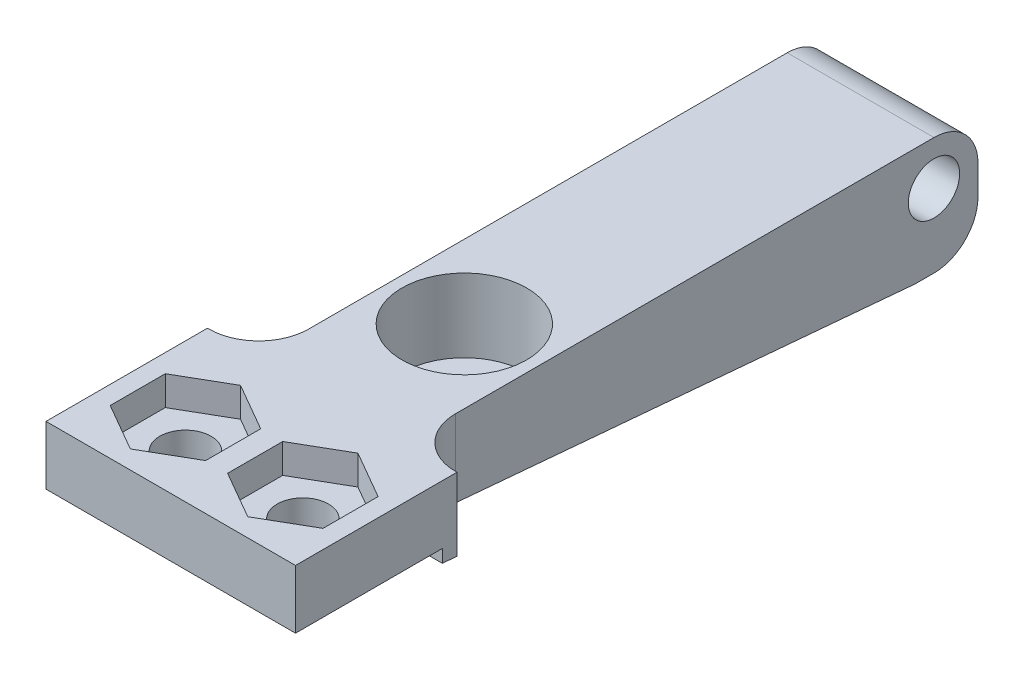
ISO-10303-21;
HEADER;
FILE_DESCRIPTION(('STEP AP214'),'2;1');
FILE_NAME('part.step','',(''),(''),'','','');
FILE_SCHEMA(('AUTOMOTIVE_DESIGN { 1 0 10303 214 1 1 1 1 }'));
ENDSEC;
DATA;
#1=APPLICATION_CONTEXT('core data for automotive mechanical design processes');
#2=APPLICATION_PROTOCOL_DEFINITION('international standard','automotive_design',2000,#1);
#3=PRODUCT_CONTEXT('',#1,'mechanical');
#4=PRODUCT('Part','Part','',(#3));
#5=PRODUCT_RELATED_PRODUCT_CATEGORY('part','',(#4));
#6=PRODUCT_DEFINITION_FORMATION('','',#4);
#7=PRODUCT_DEFINITION_CONTEXT('part definition',#1,'design');
#8=PRODUCT_DEFINITION('design','',#6,#7);
#9=PRODUCT_DEFINITION_SHAPE('','',#8);
#10=(LENGTH_UNIT() NAMED_UNIT(*) SI_UNIT(.MILLI.,.METRE.));
#11=(NAMED_UNIT(*) PLANE_ANGLE_UNIT() SI_UNIT($,.RADIAN.));
#12=(NAMED_UNIT(*) SI_UNIT($,.STERADIAN.) SOLID_ANGLE_UNIT());
#13=UNCERTAINTY_MEASURE_WITH_UNIT(LENGTH_MEASURE(1.E-05),#10,'distance_accuracy_value','');
#14=(GEOMETRIC_REPRESENTATION_CONTEXT(3) GLOBAL_UNCERTAINTY_ASSIGNED_CONTEXT((#13)) GLOBAL_UNIT_ASSIGNED_CONTEXT((#10,
#11,#12)) REPRESENTATION_CONTEXT('',''));
#15=CARTESIAN_POINT('',(0.,0.,0.));
#16=DIRECTION('',(0.,0.,1.));
#17=DIRECTION('',(1.,0.,0.));
#18=AXIS2_PLACEMENT_3D('',#15,#16,#17);
#19=CARTESIAN_POINT('',(4.,-5.,42.));
#20=DIRECTION('',(0.,1.,0.));
#21=DIRECTION('',(0.,0.,-1.));
#22=AXIS2_PLACEMENT_3D('',#19,#20,#21);
#23=CYLINDRICAL_SURFACE('',#22,1.75);
#24=CARTESIAN_POINT('',(4.,-1.,42.));
#25=DIRECTION('',(0.,1.,0.));
#26=DIRECTION('',(0.,0.,1.));
#27=AXIS2_PLACEMENT_3D('',#24,#25,#26);
#28=CIRCLE('',#27,1.75);
#29=CARTESIAN_POINT('',(4.,-1.,43.75));
#30=VERTEX_POINT('',#29);
#31=EDGE_CURVE('E354',#30,#30,#28,.T.);
#32=ORIENTED_EDGE('',*,*,#31,.F.);
#33=EDGE_LOOP('',(#32));
#34=FACE_BOUND('',#33,.T.);
#35=CARTESIAN_POINT('',(4.,1.,42.));
#36=DIRECTION('',(0.,-1.,0.));
#37=DIRECTION('',(0.,0.,-1.));
#38=AXIS2_PLACEMENT_3D('',#35,#36,#37);
#39=CIRCLE('',#38,1.75);
#40=CARTESIAN_POINT('',(4.,1.,40.25));
#41=VERTEX_POINT('',#40);
#42=EDGE_CURVE('E316',#41,#41,#39,.T.);
#43=ORIENTED_EDGE('',*,*,#42,.F.);
#44=EDGE_LOOP('',(#43));
#45=FACE_BOUND('',#44,.T.);
#46=ADVANCED_FACE('F41',(#34,#45),#23,.F.);
#47=CARTESIAN_POINT('',(-4.,-5.,42.));
#48=DIRECTION('',(0.,1.,0.));
#49=DIRECTION('',(0.,0.,-1.));
#50=AXIS2_PLACEMENT_3D('',#47,#48,#49);
#51=CYLINDRICAL_SURFACE('',#50,1.75);
#52=CARTESIAN_POINT('',(-4.,-1.,42.));
#53=DIRECTION('',(0.,1.,0.));
#54=DIRECTION('',(0.,0.,1.));
#55=AXIS2_PLACEMENT_3D('',#52,#53,#54);
#56=CIRCLE('',#55,1.75);
#57=CARTESIAN_POINT('',(-4.,-1.,43.75));
#58=VERTEX_POINT('',#57);
#59=EDGE_CURVE('E45',#58,#58,#56,.T.);
#60=ORIENTED_EDGE('',*,*,#59,.F.);
#61=EDGE_LOOP('',(#60));
#62=FACE_BOUND('',#61,.T.);
#63=CARTESIAN_POINT('',(-4.,1.,42.));
#64=DIRECTION('',(0.,-1.,0.));
#65=DIRECTION('',(0.,0.,-1.));
#66=AXIS2_PLACEMENT_3D('',#63,#64,#65);
#67=CIRCLE('',#66,1.75);
#68=CARTESIAN_POINT('',(-4.,1.,40.25));
#69=VERTEX_POINT('',#68);
#70=EDGE_CURVE('E364',#69,#69,#67,.T.);
#71=ORIENTED_EDGE('',*,*,#70,.F.);
#72=EDGE_LOOP('',(#71));
#73=FACE_BOUND('',#72,.T.);
#74=ADVANCED_FACE('F454',(#62,#73),#51,.F.);
#75=CARTESIAN_POINT('',(8.5,3.,0.));
#76=DIRECTION('',(0.,1.,0.));
#77=DIRECTION('',(0.,0.,-1.));
#78=AXIS2_PLACEMENT_3D('',#75,#76,#77);
#79=PLANE('',#78);
#80=DIRECTION('',(0.,0.,-1.));
#81=VECTOR('',#80,1.);
#82=CARTESIAN_POINT('',(5.00000000000001,3.,-3.));
#83=LINE('',#82,#81);
#84=CARTESIAN_POINT('',(5.,3.,32.6));
#85=VERTEX_POINT('',#84);
#86=CARTESIAN_POINT('',(5.,3.,0.));
#87=VERTEX_POINT('',#86);
#88=EDGE_CURVE('E235',#85,#87,#83,.T.);
#89=ORIENTED_EDGE('',*,*,#88,.T.);
#90=DIRECTION('',(-1.,0.,0.));
#91=VECTOR('',#90,1.);
#92=CARTESIAN_POINT('',(8.5,3.,0.));
#93=LINE('',#92,#91);
#94=CARTESIAN_POINT('',(-5.,3.,0.));
#95=VERTEX_POINT('',#94);
#96=EDGE_CURVE('E443',#87,#95,#93,.T.);
#97=ORIENTED_EDGE('',*,*,#96,.T.);
#98=DIRECTION('',(0.,0.,1.));
#99=VECTOR('',#98,1.);
#100=CARTESIAN_POINT('',(-5.,3.,-3.));
#101=LINE('',#100,#99);
#102=CARTESIAN_POINT('',(-5.,3.,32.6));
#103=VERTEX_POINT('',#102);
#104=EDGE_CURVE('E298',#95,#103,#101,.T.);
#105=ORIENTED_EDGE('',*,*,#104,.T.);
#106=CARTESIAN_POINT('',(-8.4,3.,32.6));
#107=DIRECTION('',(0.,-1.,0.));
#108=DIRECTION('',(0.,0.,-1.));
#109=AXIS2_PLACEMENT_3D('',#106,#107,#108);
#110=CIRCLE('',#109,3.40000000000001);
#111=CARTESIAN_POINT('',(-8.4,3.,36.));
#112=VERTEX_POINT('',#111);
#113=EDGE_CURVE('E295',#103,#112,#110,.T.);
#114=ORIENTED_EDGE('',*,*,#113,.T.);
#115=DIRECTION('',(-1.,0.,-1.38777878078145E-13));
#116=VECTOR('',#115,1.);
#117=CARTESIAN_POINT('',(-8.4,3.,36.));
#118=LINE('',#117,#116);
#119=CARTESIAN_POINT('',(-8.5,3.,36.));
#120=VERTEX_POINT('',#119);
#121=EDGE_CURVE('E287',#112,#120,#118,.T.);
#122=ORIENTED_EDGE('',*,*,#121,.T.);
#123=DIRECTION('',(0.,0.,1.));
#124=VECTOR('',#123,1.);
#125=CARTESIAN_POINT('',(-8.5,3.,0.));
#126=LINE('',#125,#124);
#127=CARTESIAN_POINT('',(-8.5,3.,47.));
#128=VERTEX_POINT('',#127);
#129=EDGE_CURVE('E416',#120,#128,#126,.T.);
#130=ORIENTED_EDGE('',*,*,#129,.T.);
#131=DIRECTION('',(-1.,0.,0.));
#132=VECTOR('',#131,1.);
#133=CARTESIAN_POINT('',(8.5,3.,47.));
#134=LINE('',#133,#132);
#135=CARTESIAN_POINT('',(8.5,3.,47.));
#136=VERTEX_POINT('',#135);
#137=EDGE_CURVE('E415',#136,#128,#134,.T.);
#138=ORIENTED_EDGE('',*,*,#137,.F.);
#139=DIRECTION('',(0.,0.,1.));
#140=VECTOR('',#139,1.);
#141=CARTESIAN_POINT('',(8.5,3.,0.));
#142=LINE('',#141,#140);
#143=CARTESIAN_POINT('',(8.5,3.,36.));
#144=VERTEX_POINT('',#143);
#145=EDGE_CURVE('E245',#144,#136,#142,.T.);
#146=ORIENTED_EDGE('',*,*,#145,.F.);
#147=DIRECTION('',(-1.,0.,1.38777878078145E-13));
#148=VECTOR('',#147,1.);
#149=CARTESIAN_POINT('',(8.4,3.,36.));
#150=LINE('',#149,#148);
#151=CARTESIAN_POINT('',(8.4,3.,36.));
#152=VERTEX_POINT('',#151);
#153=EDGE_CURVE('E230',#144,#152,#150,.T.);
#154=ORIENTED_EDGE('',*,*,#153,.T.);
#155=CARTESIAN_POINT('',(8.4,3.,32.6));
#156=DIRECTION('',(0.,-1.,0.));
#157=DIRECTION('',(0.,0.,-1.));
#158=AXIS2_PLACEMENT_3D('',#155,#156,#157);
#159=CIRCLE('',#158,3.40000000000001);
#160=EDGE_CURVE('E264',#152,#85,#159,.T.);
#161=ORIENTED_EDGE('',*,*,#160,.T.);
#162=EDGE_LOOP('',(#89,#97,#105,#114,#122,#130,#138,#146,#154,#161));
#163=FACE_BOUND('',#162,.T.);
#164=CARTESIAN_POINT('',(0.,3.,27.));
#165=DIRECTION('',(0.,-1.,0.));
#166=DIRECTION('',(0.,0.,-1.));
#167=AXIS2_PLACEMENT_3D('',#164,#165,#166);
#168=CIRCLE('',#167,4.25);
#169=CARTESIAN_POINT('',(0.,3.,22.75));
#170=VERTEX_POINT('',#169);
#171=EDGE_CURVE('E271',#170,#170,#168,.T.);
#172=ORIENTED_EDGE('',*,*,#171,.T.);
#173=EDGE_LOOP('',(#172));
#174=FACE_BOUND('',#173,.T.);
#175=DIRECTION('',(-0.86602540378444,0.,-0.499999999999997));
#176=VECTOR('',#175,1.);
#177=CARTESIAN_POINT('',(-18.8115334794732,3.,32.5825317547307));
#178=LINE('',#177,#176);
#179=CARTESIAN_POINT('',(4.00000000000001,3.,45.7527767497326));
#180=VERTEX_POINT('',#179);
#181=CARTESIAN_POINT('',(0.749999999999983,3.,43.8763883748663));
#182=VERTEX_POINT('',#181);
#183=EDGE_CURVE('E334',#180,#182,#178,.T.);
#184=ORIENTED_EDGE('',*,*,#183,.T.);
#185=DIRECTION('',(0.,0.,-1.));
#186=VECTOR('',#185,1.);
#187=CARTESIAN_POINT('',(0.749999999999976,3.,0.));
#188=LINE('',#187,#186);
#189=CARTESIAN_POINT('',(0.749999999999983,3.,40.1236116251337));
#190=VERTEX_POINT('',#189);
#191=EDGE_CURVE('E337',#182,#190,#188,.T.);
#192=ORIENTED_EDGE('',*,*,#191,.T.);
#193=DIRECTION('',(0.866025403784439,0.,-0.5));
#194=VECTOR('',#193,1.);
#195=CARTESIAN_POINT('',(17.5615334794732,3.,30.4174682452694));
#196=LINE('',#195,#194);
#197=CARTESIAN_POINT('',(4.00000000000001,3.,38.2472232502674));
#198=VERTEX_POINT('',#197);
#199=EDGE_CURVE('E341',#190,#198,#196,.T.);
#200=ORIENTED_EDGE('',*,*,#199,.T.);
#201=DIRECTION('',(0.866025403784439,0.,0.499999999999999));
#202=VECTOR('',#201,1.);
#203=CARTESIAN_POINT('',(-15.5615334794732,3.,26.9533666301317));
#204=LINE('',#203,#202);
#205=CARTESIAN_POINT('',(7.25000000000003,3.,40.1236116251337));
#206=VERTEX_POINT('',#205);
#207=EDGE_CURVE('E344',#198,#206,#204,.T.);
#208=ORIENTED_EDGE('',*,*,#207,.T.);
#209=DIRECTION('',(0.,0.,1.));
#210=VECTOR('',#209,1.);
#211=CARTESIAN_POINT('',(7.25000000000003,3.,0.));
#212=LINE('',#211,#210);
#213=CARTESIAN_POINT('',(7.25000000000003,3.,43.8763883748663));
#214=VERTEX_POINT('',#213);
#215=EDGE_CURVE('E347',#206,#214,#212,.T.);
#216=ORIENTED_EDGE('',*,*,#215,.T.);
#217=DIRECTION('',(-0.866025403784439,0.,0.5));
#218=VECTOR('',#217,1.);
#219=CARTESIAN_POINT('',(20.8115334794732,3.,36.0466333698683));
#220=LINE('',#219,#218);
#221=EDGE_CURVE('E320',#214,#180,#220,.T.);
#222=ORIENTED_EDGE('',*,*,#221,.T.);
#223=EDGE_LOOP('',(#184,#192,#200,#208,#216,#222));
#224=FACE_BOUND('',#223,.T.);
#225=DIRECTION('',(0.866025403784439,0.,0.5));
#226=VECTOR('',#225,1.);
#227=CARTESIAN_POINT('',(-17.5615334794732,3.,30.4174682452695));
#228=LINE('',#227,#226);
#229=CARTESIAN_POINT('',(-4.,3.,38.2472232502674));
#230=VERTEX_POINT('',#229);
#231=CARTESIAN_POINT('',(-0.749999999999987,3.,40.1236116251337));
#232=VERTEX_POINT('',#231);
#233=EDGE_CURVE('E313',#230,#232,#228,.T.);
#234=ORIENTED_EDGE('',*,*,#233,.T.);
#235=DIRECTION('',(0.,0.,1.));
#236=VECTOR('',#235,1.);
#237=CARTESIAN_POINT('',(-0.749999999999987,3.,0.));
#238=LINE('',#237,#236);
#239=CARTESIAN_POINT('',(-0.749999999999987,3.,43.8763883748663));
#240=VERTEX_POINT('',#239);
#241=EDGE_CURVE('E384',#232,#240,#238,.T.);
#242=ORIENTED_EDGE('',*,*,#241,.T.);
#243=DIRECTION('',(-0.866025403784441,0.,0.499999999999996));
#244=VECTOR('',#243,1.);
#245=CARTESIAN_POINT('',(18.8115334794731,3.,32.5825317547307));
#246=LINE('',#245,#244);
#247=CARTESIAN_POINT('',(-3.99999999999999,3.,45.7527767497326));
#248=VERTEX_POINT('',#247);
#249=EDGE_CURVE('E387',#240,#248,#246,.T.);
#250=ORIENTED_EDGE('',*,*,#249,.T.);
#251=DIRECTION('',(-0.86602540378444,0.,-0.499999999999998));
#252=VECTOR('',#251,1.);
#253=CARTESIAN_POINT('',(-20.8115334794731,3.,36.0466333698684));
#254=LINE('',#253,#252);
#255=CARTESIAN_POINT('',(-7.25000000000002,3.,43.8763883748663));
#256=VERTEX_POINT('',#255);
#257=EDGE_CURVE('E390',#248,#256,#254,.T.);
#258=ORIENTED_EDGE('',*,*,#257,.T.);
#259=DIRECTION('',(0.,0.,-1.));
#260=VECTOR('',#259,1.);
#261=CARTESIAN_POINT('',(-7.25000000000001,3.,0.));
#262=LINE('',#261,#260);
#263=CARTESIAN_POINT('',(-7.25000000000001,3.,40.1236116251337));
#264=VERTEX_POINT('',#263);
#265=EDGE_CURVE('E393',#256,#264,#262,.T.);
#266=ORIENTED_EDGE('',*,*,#265,.T.);
#267=DIRECTION('',(0.866025403784439,0.,-0.5));
#268=VECTOR('',#267,1.);
#269=CARTESIAN_POINT('',(15.5615334794732,3.,26.9533666301317));
#270=LINE('',#269,#268);
#271=EDGE_CURVE('E368',#264,#230,#270,.T.);
#272=ORIENTED_EDGE('',*,*,#271,.T.);
#273=EDGE_LOOP('',(#234,#242,#250,#258,#266,#272));
#274=FACE_BOUND('',#273,.T.);
#275=ADVANCED_FACE('F457',(#163,#174,#224,#274),#79,.T.);
#276=CARTESIAN_POINT('',(8.5,0.,0.));
#277=DIRECTION('',(-1.,0.,0.));
#278=DIRECTION('',(0.,0.,-1.));
#279=AXIS2_PLACEMENT_3D('',#276,#277,#278);
#280=CYLINDRICAL_SURFACE('',#279,3.);
#281=DIRECTION('',(-1.,0.,0.));
#282=VECTOR('',#281,1.);
#283=CARTESIAN_POINT('',(8.5,0.,-3.));
#284=LINE('',#283,#282);
#285=CARTESIAN_POINT('',(5.00000000000001,0.,-3.));
#286=VERTEX_POINT('',#285);
#287=CARTESIAN_POINT('',(-5.,0.,-3.));
#288=VERTEX_POINT('',#287);
#289=EDGE_CURVE('E440',#286,#288,#284,.T.);
#290=ORIENTED_EDGE('',*,*,#289,.T.);
#291=CARTESIAN_POINT('',(-5.,0.,0.));
#292=DIRECTION('',(-1.,0.,0.));
#293=DIRECTION('',(0.,0.,1.));
#294=AXIS2_PLACEMENT_3D('',#291,#292,#293);
#295=CIRCLE('',#294,3.);
#296=EDGE_CURVE('E307',#288,#95,#295,.F.);
#297=ORIENTED_EDGE('',*,*,#296,.T.);
#298=ORIENTED_EDGE('',*,*,#96,.F.);
#299=CARTESIAN_POINT('',(5.00000000000001,0.,0.));
#300=DIRECTION('',(1.,0.,0.));
#301=DIRECTION('',(0.,0.,-1.));
#302=AXIS2_PLACEMENT_3D('',#299,#300,#301);
#303=CIRCLE('',#302,3.);
#304=EDGE_CURVE('E309',#87,#286,#303,.F.);
#305=ORIENTED_EDGE('',*,*,#304,.T.);
#306=EDGE_LOOP('',(#290,#297,#298,#305));
#307=FACE_BOUND('',#306,.T.);
#308=ADVANCED_FACE('F535',(#307),#280,.T.);
#309=CARTESIAN_POINT('',(8.5,0.,-3.));
#310=DIRECTION('',(0.,0.,1.));
#311=DIRECTION('',(-1.,0.,0.));
#312=AXIS2_PLACEMENT_3D('',#309,#310,#311);
#313=PLANE('',#312);
#314=DIRECTION('',(-1.,0.,0.));
#315=VECTOR('',#314,1.);
#316=CARTESIAN_POINT('',(8.5,-2.,-3.));
#317=LINE('',#316,#315);
#318=CARTESIAN_POINT('',(-5.,-2.,-3.));
#319=VERTEX_POINT('',#318);
#320=CARTESIAN_POINT('',(5.00000000000001,-2.,-3.));
#321=VERTEX_POINT('',#320);
#322=EDGE_CURVE('E11',#319,#321,#317,.F.);
#323=ORIENTED_EDGE('',*,*,#322,.F.);
#324=DIRECTION('',(0.,1.,0.));
#325=VECTOR('',#324,1.);
#326=CARTESIAN_POINT('',(-5.,-5.001,-3.));
#327=LINE('',#326,#325);
#328=EDGE_CURVE('E285',#319,#288,#327,.T.);
#329=ORIENTED_EDGE('',*,*,#328,.T.);
#330=ORIENTED_EDGE('',*,*,#289,.F.);
#331=DIRECTION('',(0.,1.,0.));
#332=VECTOR('',#331,1.);
#333=CARTESIAN_POINT('',(5.00000000000001,-5.001,-3.));
#334=LINE('',#333,#332);
#335=EDGE_CURVE('E269',#321,#286,#334,.T.);
#336=ORIENTED_EDGE('',*,*,#335,.F.);
#337=EDGE_LOOP('',(#323,#329,#330,#336));
#338=FACE_BOUND('',#337,.T.);
#339=ADVANCED_FACE('F531',(#338),#313,.F.);
#340=CARTESIAN_POINT('',(8.5,-5.,0.));
#341=DIRECTION('',(0.,1.,0.));
#342=DIRECTION('',(0.,0.,-1.));
#343=AXIS2_PLACEMENT_3D('',#340,#341,#342);
#344=PLANE('',#343);
#345=DIRECTION('',(-1.,0.,0.));
#346=VECTOR('',#345,1.);
#347=CARTESIAN_POINT('',(8.5,-5.,1.27979078895471));
#348=LINE('',#347,#346);
#349=CARTESIAN_POINT('',(5.,-5.,1.27979078895471));
#350=VERTEX_POINT('',#349);
#351=CARTESIAN_POINT('',(-5.,-5.,1.27979078895471));
#352=VERTEX_POINT('',#351);
#353=EDGE_CURVE('E437',#350,#352,#348,.T.);
#354=ORIENTED_EDGE('',*,*,#353,.T.);
#355=DIRECTION('',(0.,0.,-1.));
#356=VECTOR('',#355,1.);
#357=CARTESIAN_POINT('',(-5.,-5.,-3.));
#358=LINE('',#357,#356);
#359=CARTESIAN_POINT('',(-5.,-5.,0.));
#360=VERTEX_POINT('',#359);
#361=EDGE_CURVE('E281',#352,#360,#358,.T.);
#362=ORIENTED_EDGE('',*,*,#361,.T.);
#363=DIRECTION('',(-1.,0.,0.));
#364=VECTOR('',#363,1.);
#365=CARTESIAN_POINT('',(8.5,-5.,0.));
#366=LINE('',#365,#364);
#367=CARTESIAN_POINT('',(5.00000000000001,-5.,0.));
#368=VERTEX_POINT('',#367);
#369=EDGE_CURVE('E50',#368,#360,#366,.T.);
#370=ORIENTED_EDGE('',*,*,#369,.F.);
#371=DIRECTION('',(0.,0.,1.));
#372=VECTOR('',#371,1.);
#373=CARTESIAN_POINT('',(5.00000000000001,-5.,-3.));
#374=LINE('',#373,#372);
#375=EDGE_CURVE('E260',#368,#350,#374,.T.);
#376=ORIENTED_EDGE('',*,*,#375,.T.);
#377=EDGE_LOOP('',(#354,#362,#370,#376));
#378=FACE_BOUND('',#377,.T.);
#379=ADVANCED_FACE('F528',(#378),#344,.F.);
#380=CARTESIAN_POINT('',(8.5,-5.07313605167897,0.443841893046577));
#381=DIRECTION('',(0.,0.996194698091746,-0.0871557427476583));
#382=DIRECTION('',(0.,-0.0871557427476583,-0.996194698091746));
#383=AXIS2_PLACEMENT_3D('',#380,#381,#382);
#384=PLANE('',#383);
#385=CARTESIAN_POINT('',(8.4,-2.25983675477331,32.6));
#386=DIRECTION('',(0.,-0.996194698091746,0.0871557427476583));
#387=DIRECTION('',(0.,0.0871557427476583,0.996194698091746));
#388=AXIS2_PLACEMENT_3D('',#385,#386,#387);
#389=ELLIPSE('',#388,3.41298744764739,3.40000000000001);
#390=CARTESIAN_POINT('',(5.,-2.25983675477331,32.6));
#391=VERTEX_POINT('',#390);
#392=CARTESIAN_POINT('',(8.4,-1.96237529878516,36.));
#393=VERTEX_POINT('',#392);
#394=EDGE_CURVE('E250',#391,#393,#389,.F.);
#395=ORIENTED_EDGE('',*,*,#394,.T.);
#396=DIRECTION('',(1.,0.,-1.38777878078145E-13));
#397=VECTOR('',#396,1.);
#398=CARTESIAN_POINT('',(8.40000000000004,-1.96237529878516,36.));
#399=LINE('',#398,#397);
#400=CARTESIAN_POINT('',(8.5,-1.96237529878516,36.));
#401=VERTEX_POINT('',#400);
#402=EDGE_CURVE('E227',#393,#401,#399,.T.);
#403=ORIENTED_EDGE('',*,*,#402,.T.);
#404=DIRECTION('',(0.,0.0871557427476583,0.996194698091746));
#405=VECTOR('',#404,1.);
#406=CARTESIAN_POINT('',(8.5,-5.07313605167897,0.443841893046577));
#407=LINE('',#406,#405);
#408=CARTESIAN_POINT('',(8.5,-1.87488663525924,37.));
#409=VERTEX_POINT('',#408);
#410=EDGE_CURVE('E238',#401,#409,#407,.T.);
#411=ORIENTED_EDGE('',*,*,#410,.T.);
#412=DIRECTION('',(-1.,0.,0.));
#413=VECTOR('',#412,1.);
#414=CARTESIAN_POINT('',(8.5,-1.87488663525924,37.));
#415=LINE('',#414,#413);
#416=CARTESIAN_POINT('',(-8.5,-1.87488663525924,37.));
#417=VERTEX_POINT('',#416);
#418=EDGE_CURVE('E435',#409,#417,#415,.T.);
#419=ORIENTED_EDGE('',*,*,#418,.T.);
#420=DIRECTION('',(0.,0.0871557427476583,0.996194698091746));
#421=VECTOR('',#420,1.);
#422=CARTESIAN_POINT('',(-8.5,-5.07313605167897,0.443841893046577));
#423=LINE('',#422,#421);
#424=CARTESIAN_POINT('',(-8.5,-1.96237529878517,36.));
#425=VERTEX_POINT('',#424);
#426=EDGE_CURVE('E419',#425,#417,#423,.T.);
#427=ORIENTED_EDGE('',*,*,#426,.F.);
#428=DIRECTION('',(1.,0.,1.38777878078145E-13));
#429=VECTOR('',#428,1.);
#430=CARTESIAN_POINT('',(-8.40000000000004,-1.96237529878516,36.));
#431=LINE('',#430,#429);
#432=CARTESIAN_POINT('',(-8.4,-1.96237529878516,36.));
#433=VERTEX_POINT('',#432);
#434=EDGE_CURVE('E301',#425,#433,#431,.T.);
#435=ORIENTED_EDGE('',*,*,#434,.T.);
#436=CARTESIAN_POINT('',(-8.4,-2.25983675477331,32.6));
#437=DIRECTION('',(0.,-0.996194698091746,0.0871557427476583));
#438=DIRECTION('',(0.,0.0871557427476583,0.996194698091746));
#439=AXIS2_PLACEMENT_3D('',#436,#437,#438);
#440=ELLIPSE('',#439,3.41298744764739,3.40000000000001);
#441=CARTESIAN_POINT('',(-5.,-2.25983675477331,32.6));
#442=VERTEX_POINT('',#441);
#443=EDGE_CURVE('E278',#433,#442,#440,.F.);
#444=ORIENTED_EDGE('',*,*,#443,.T.);
#445=DIRECTION('',(0.,-0.0871557427476583,-0.996194698091746));
#446=VECTOR('',#445,1.);
#447=CARTESIAN_POINT('',(-5.,-5.37159653177234,-2.96757700472789));
#448=LINE('',#447,#446);
#449=EDGE_CURVE('E279',#442,#352,#448,.T.);
#450=ORIENTED_EDGE('',*,*,#449,.T.);
#451=ORIENTED_EDGE('',*,*,#353,.F.);
#452=DIRECTION('',(0.,0.0871557427476583,0.996194698091746));
#453=VECTOR('',#452,1.);
#454=CARTESIAN_POINT('',(5.00000000000001,-5.37159653177234,-2.96757700472789));
#455=LINE('',#454,#453);
#456=EDGE_CURVE('E253',#350,#391,#455,.T.);
#457=ORIENTED_EDGE('',*,*,#456,.T.);
#458=EDGE_LOOP('',(#395,#403,#411,#419,#427,#435,#444,#450,#451,#457));
#459=FACE_BOUND('',#458,.T.);
#460=ADVANCED_FACE('F247',(#459),#384,.F.);
#461=CARTESIAN_POINT('',(8.5,0.,37.));
#462=DIRECTION('',(0.,0.,1.));
#463=DIRECTION('',(-1.,0.,0.));
#464=AXIS2_PLACEMENT_3D('',#461,#462,#463);
#465=PLANE('',#464);
#466=DIRECTION('',(0.,-1.,0.));
#467=VECTOR('',#466,1.);
#468=CARTESIAN_POINT('',(-8.5,0.,37.));
#469=LINE('',#468,#467);
#470=CARTESIAN_POINT('',(-8.5,-1.,37.));
#471=VERTEX_POINT('',#470);
#472=EDGE_CURVE('E422',#471,#417,#469,.T.);
#473=ORIENTED_EDGE('',*,*,#472,.T.);
#474=ORIENTED_EDGE('',*,*,#418,.F.);
#475=DIRECTION('',(0.,-1.,0.));
#476=VECTOR('',#475,1.);
#477=CARTESIAN_POINT('',(8.5,0.,37.));
#478=LINE('',#477,#476);
#479=CARTESIAN_POINT('',(8.5,-1.,37.));
#480=VERTEX_POINT('',#479);
#481=EDGE_CURVE('E241',#480,#409,#478,.T.);
#482=ORIENTED_EDGE('',*,*,#481,.F.);
#483=DIRECTION('',(-1.,0.,0.));
#484=VECTOR('',#483,1.);
#485=CARTESIAN_POINT('',(8.5,-1.,37.));
#486=LINE('',#485,#484);
#487=EDGE_CURVE('E432',#480,#471,#486,.T.);
#488=ORIENTED_EDGE('',*,*,#487,.T.);
#489=EDGE_LOOP('',(#473,#474,#482,#488));
#490=FACE_BOUND('',#489,.T.);
#491=ADVANCED_FACE('F522',(#490),#465,.T.);
#492=CARTESIAN_POINT('',(8.5,-1.00000000000001,0.));
#493=DIRECTION('',(0.,-1.,0.));
#494=DIRECTION('',(0.,0.,1.));
#495=AXIS2_PLACEMENT_3D('',#492,#493,#494);
#496=PLANE('',#495);
#497=ORIENTED_EDGE('',*,*,#59,.T.);
#498=EDGE_LOOP('',(#497));
#499=FACE_BOUND('',#498,.T.);
#500=ORIENTED_EDGE('',*,*,#31,.T.);
#501=EDGE_LOOP('',(#500));
#502=FACE_BOUND('',#501,.T.);
#503=DIRECTION('',(0.,0.,-1.));
#504=VECTOR('',#503,1.);
#505=CARTESIAN_POINT('',(-8.5,-1.00000000000001,0.));
#506=LINE('',#505,#504);
#507=CARTESIAN_POINT('',(-8.5,-1.,47.));
#508=VERTEX_POINT('',#507);
#509=EDGE_CURVE('E424',#508,#471,#506,.T.);
#510=ORIENTED_EDGE('',*,*,#509,.T.);
#511=ORIENTED_EDGE('',*,*,#487,.F.);
#512=DIRECTION('',(0.,0.,-1.));
#513=VECTOR('',#512,1.);
#514=CARTESIAN_POINT('',(8.5,-1.00000000000001,0.));
#515=LINE('',#514,#513);
#516=CARTESIAN_POINT('',(8.5,-1.,47.));
#517=VERTEX_POINT('',#516);
#518=EDGE_CURVE('E411',#517,#480,#515,.T.);
#519=ORIENTED_EDGE('',*,*,#518,.F.);
#520=DIRECTION('',(-1.,0.,0.));
#521=VECTOR('',#520,1.);
#522=CARTESIAN_POINT('',(8.5,-1.,47.));
#523=LINE('',#522,#521);
#524=EDGE_CURVE('E429',#517,#508,#523,.T.);
#525=ORIENTED_EDGE('',*,*,#524,.T.);
#526=EDGE_LOOP('',(#510,#511,#519,#525));
#527=FACE_BOUND('',#526,.T.);
#528=ADVANCED_FACE('F452',(#499,#502,#527),#496,.T.);
#529=CARTESIAN_POINT('',(8.5,0.,47.));
#530=DIRECTION('',(0.,0.,1.));
#531=DIRECTION('',(-1.,0.,0.));
#532=AXIS2_PLACEMENT_3D('',#529,#530,#531);
#533=PLANE('',#532);
#534=DIRECTION('',(0.,-1.,0.));
#535=VECTOR('',#534,1.);
#536=CARTESIAN_POINT('',(-8.5,0.,47.));
#537=LINE('',#536,#535);
#538=EDGE_CURVE('E408',#128,#508,#537,.T.);
#539=ORIENTED_EDGE('',*,*,#538,.T.);
#540=ORIENTED_EDGE('',*,*,#524,.F.);
#541=DIRECTION('',(0.,-1.,0.));
#542=VECTOR('',#541,1.);
#543=CARTESIAN_POINT('',(8.5,0.,47.));
#544=LINE('',#543,#542);
#545=EDGE_CURVE('E413',#136,#517,#544,.T.);
#546=ORIENTED_EDGE('',*,*,#545,.F.);
#547=ORIENTED_EDGE('',*,*,#137,.T.);
#548=EDGE_LOOP('',(#539,#540,#546,#547));
#549=FACE_BOUND('',#548,.T.);
#550=ADVANCED_FACE('F513',(#549),#533,.T.);
#551=CARTESIAN_POINT('',(8.5,0.,0.));
#552=DIRECTION('',(1.,0.,0.));
#553=DIRECTION('',(0.,0.,1.));
#554=AXIS2_PLACEMENT_3D('',#551,#552,#553);
#555=PLANE('',#554);
#556=DIRECTION('',(0.,1.,0.));
#557=VECTOR('',#556,1.);
#558=CARTESIAN_POINT('',(8.5,-5.001,36.));
#559=LINE('',#558,#557);
#560=EDGE_CURVE('E223',#401,#144,#559,.T.);
#561=ORIENTED_EDGE('',*,*,#560,.T.);
#562=ORIENTED_EDGE('',*,*,#145,.T.);
#563=ORIENTED_EDGE('',*,*,#545,.T.);
#564=ORIENTED_EDGE('',*,*,#518,.T.);
#565=ORIENTED_EDGE('',*,*,#481,.T.);
#566=ORIENTED_EDGE('',*,*,#410,.F.);
#567=EDGE_LOOP('',(#561,#562,#563,#564,#565,#566));
#568=FACE_BOUND('',#567,.T.);
#569=ADVANCED_FACE('F239',(#568),#555,.T.);
#570=CARTESIAN_POINT('',(-8.5,0.,0.));
#571=DIRECTION('',(1.,0.,0.));
#572=DIRECTION('',(0.,0.,1.));
#573=AXIS2_PLACEMENT_3D('',#570,#571,#572);
#574=PLANE('',#573);
#575=ORIENTED_EDGE('',*,*,#426,.T.);
#576=ORIENTED_EDGE('',*,*,#472,.F.);
#577=ORIENTED_EDGE('',*,*,#509,.F.);
#578=ORIENTED_EDGE('',*,*,#538,.F.);
#579=ORIENTED_EDGE('',*,*,#129,.F.);
#580=DIRECTION('',(0.,1.,0.));
#581=VECTOR('',#580,1.);
#582=CARTESIAN_POINT('',(-8.5,-5.001,36.));
#583=LINE('',#582,#581);
#584=EDGE_CURVE('E284',#425,#120,#583,.T.);
#585=ORIENTED_EDGE('',*,*,#584,.F.);
#586=EDGE_LOOP('',(#575,#576,#577,#578,#579,#585));
#587=FACE_BOUND('',#586,.T.);
#588=ADVANCED_FACE('F512',(#587),#574,.F.);
#589=CARTESIAN_POINT('',(8.5,-2.,0.));
#590=DIRECTION('',(-1.,0.,0.));
#591=DIRECTION('',(0.,0.,-1.));
#592=AXIS2_PLACEMENT_3D('',#589,#590,#591);
#593=CYLINDRICAL_SURFACE('',#592,3.);
#594=CARTESIAN_POINT('',(5.00000000000001,-2.,0.));
#595=DIRECTION('',(1.,0.,0.));
#596=DIRECTION('',(0.,0.,-1.));
#597=AXIS2_PLACEMENT_3D('',#594,#595,#596);
#598=CIRCLE('',#597,3.);
#599=EDGE_CURVE('E66',#368,#321,#598,.T.);
#600=ORIENTED_EDGE('',*,*,#599,.F.);
#601=ORIENTED_EDGE('',*,*,#369,.T.);
#602=CARTESIAN_POINT('',(-5.,-2.,0.));
#603=DIRECTION('',(-1.,0.,0.));
#604=DIRECTION('',(0.,0.,1.));
#605=AXIS2_PLACEMENT_3D('',#602,#603,#604);
#606=CIRCLE('',#605,3.);
#607=EDGE_CURVE('E58',#319,#360,#606,.T.);
#608=ORIENTED_EDGE('',*,*,#607,.F.);
#609=ORIENTED_EDGE('',*,*,#322,.T.);
#610=EDGE_LOOP('',(#600,#601,#608,#609));
#611=FACE_BOUND('',#610,.T.);
#612=ADVANCED_FACE('F43',(#611),#593,.T.);
#613=CARTESIAN_POINT('',(-17.5615334794732,1.,30.4174682452695));
#614=DIRECTION('',(0.5,0.,-0.866025403784439));
#615=DIRECTION('',(0.866025403784439,0.,0.5));
#616=AXIS2_PLACEMENT_3D('',#613,#614,#615);
#617=PLANE('',#616);
#618=ORIENTED_EDGE('',*,*,#233,.F.);
#619=DIRECTION('',(0.,1.,0.));
#620=VECTOR('',#619,1.);
#621=CARTESIAN_POINT('',(-4.,1.,38.2472232502674));
#622=LINE('',#621,#620);
#623=CARTESIAN_POINT('',(-4.,1.,38.2472232502674));
#624=VERTEX_POINT('',#623);
#625=EDGE_CURVE('E338',#624,#230,#622,.T.);
#626=ORIENTED_EDGE('',*,*,#625,.F.);
#627=DIRECTION('',(0.866025403784439,0.,0.5));
#628=VECTOR('',#627,1.);
#629=CARTESIAN_POINT('',(-17.5615334794732,1.,30.4174682452695));
#630=LINE('',#629,#628);
#631=CARTESIAN_POINT('',(-0.749999999999987,1.,40.1236116251337));
#632=VERTEX_POINT('',#631);
#633=EDGE_CURVE('E367',#624,#632,#630,.T.);
#634=ORIENTED_EDGE('',*,*,#633,.T.);
#635=DIRECTION('',(0.,1.,0.));
#636=VECTOR('',#635,1.);
#637=CARTESIAN_POINT('',(-0.749999999999987,1.,40.1236116251337));
#638=LINE('',#637,#636);
#639=EDGE_CURVE('E381',#632,#232,#638,.T.);
#640=ORIENTED_EDGE('',*,*,#639,.T.);
#641=EDGE_LOOP('',(#618,#626,#634,#640));
#642=FACE_BOUND('',#641,.T.);
#643=ADVANCED_FACE('F476',(#642),#617,.F.);
#644=CARTESIAN_POINT('',(15.5615334794732,1.,26.9533666301317));
#645=DIRECTION('',(-0.5,0.,-0.866025403784439));
#646=DIRECTION('',(0.866025403784439,0.,-0.5));
#647=AXIS2_PLACEMENT_3D('',#644,#645,#646);
#648=PLANE('',#647);
#649=ORIENTED_EDGE('',*,*,#271,.F.);
#650=DIRECTION('',(0.,1.,0.));
#651=VECTOR('',#650,1.);
#652=CARTESIAN_POINT('',(-7.25000000000001,1.,40.1236116251337));
#653=LINE('',#652,#651);
#654=CARTESIAN_POINT('',(-7.25000000000001,1.,40.1236116251337));
#655=VERTEX_POINT('',#654);
#656=EDGE_CURVE('E399',#655,#264,#653,.T.);
#657=ORIENTED_EDGE('',*,*,#656,.F.);
#658=DIRECTION('',(0.866025403784439,0.,-0.5));
#659=VECTOR('',#658,1.);
#660=CARTESIAN_POINT('',(15.5615334794732,1.,26.9533666301317));
#661=LINE('',#660,#659);
#662=EDGE_CURVE('E379',#655,#624,#661,.T.);
#663=ORIENTED_EDGE('',*,*,#662,.T.);
#664=ORIENTED_EDGE('',*,*,#625,.T.);
#665=EDGE_LOOP('',(#649,#657,#663,#664));
#666=FACE_BOUND('',#665,.T.);
#667=ADVANCED_FACE('F479',(#666),#648,.F.);
#668=CARTESIAN_POINT('',(-7.25000000000001,1.,0.));
#669=DIRECTION('',(-1.,0.,0.));
#670=DIRECTION('',(0.,0.,-1.));
#671=AXIS2_PLACEMENT_3D('',#668,#669,#670);
#672=PLANE('',#671);
#673=ORIENTED_EDGE('',*,*,#265,.F.);
#674=DIRECTION('',(0.,1.,0.));
#675=VECTOR('',#674,1.);
#676=CARTESIAN_POINT('',(-7.25000000000002,1.,43.8763883748663));
#677=LINE('',#676,#675);
#678=CARTESIAN_POINT('',(-7.25000000000002,1.,43.8763883748663));
#679=VERTEX_POINT('',#678);
#680=EDGE_CURVE('E401',#679,#256,#677,.T.);
#681=ORIENTED_EDGE('',*,*,#680,.F.);
#682=DIRECTION('',(0.,0.,-1.));
#683=VECTOR('',#682,1.);
#684=CARTESIAN_POINT('',(-7.25000000000001,1.,0.));
#685=LINE('',#684,#683);
#686=EDGE_CURVE('E377',#679,#655,#685,.T.);
#687=ORIENTED_EDGE('',*,*,#686,.T.);
#688=ORIENTED_EDGE('',*,*,#656,.T.);
#689=EDGE_LOOP('',(#673,#681,#687,#688));
#690=FACE_BOUND('',#689,.T.);
#691=ADVANCED_FACE('F485',(#690),#672,.F.);
#692=CARTESIAN_POINT('',(-20.8115334794731,1.,36.0466333698684));
#693=DIRECTION('',(-0.499999999999998,0.,0.86602540378444));
#694=DIRECTION('',(-0.86602540378444,0.,-0.499999999999998));
#695=AXIS2_PLACEMENT_3D('',#692,#693,#694);
#696=PLANE('',#695);
#697=ORIENTED_EDGE('',*,*,#257,.F.);
#698=DIRECTION('',(0.,1.,0.));
#699=VECTOR('',#698,1.);
#700=CARTESIAN_POINT('',(-3.99999999999999,1.,45.7527767497326));
#701=LINE('',#700,#699);
#702=CARTESIAN_POINT('',(-3.99999999999999,1.,45.7527767497326));
#703=VERTEX_POINT('',#702);
#704=EDGE_CURVE('E403',#703,#248,#701,.T.);
#705=ORIENTED_EDGE('',*,*,#704,.F.);
#706=DIRECTION('',(-0.86602540378444,0.,-0.499999999999998));
#707=VECTOR('',#706,1.);
#708=CARTESIAN_POINT('',(-20.8115334794731,1.,36.0466333698684));
#709=LINE('',#708,#707);
#710=EDGE_CURVE('E375',#703,#679,#709,.T.);
#711=ORIENTED_EDGE('',*,*,#710,.T.);
#712=ORIENTED_EDGE('',*,*,#680,.T.);
#713=EDGE_LOOP('',(#697,#705,#711,#712));
#714=FACE_BOUND('',#713,.T.);
#715=ADVANCED_FACE('F490',(#714),#696,.F.);
#716=CARTESIAN_POINT('',(18.8115334794731,1.,32.5825317547307));
#717=DIRECTION('',(0.499999999999996,0.,0.866025403784441));
#718=DIRECTION('',(-0.866025403784441,0.,0.499999999999996));
#719=AXIS2_PLACEMENT_3D('',#716,#717,#718);
#720=PLANE('',#719);
#721=ORIENTED_EDGE('',*,*,#249,.F.);
#722=DIRECTION('',(0.,1.,0.));
#723=VECTOR('',#722,1.);
#724=CARTESIAN_POINT('',(-0.749999999999987,1.,43.8763883748663));
#725=LINE('',#724,#723);
#726=CARTESIAN_POINT('',(-0.749999999999987,1.,43.8763883748663));
#727=VERTEX_POINT('',#726);
#728=EDGE_CURVE('E405',#727,#240,#725,.T.);
#729=ORIENTED_EDGE('',*,*,#728,.F.);
#730=DIRECTION('',(-0.866025403784441,0.,0.499999999999996));
#731=VECTOR('',#730,1.);
#732=CARTESIAN_POINT('',(18.8115334794731,1.,32.5825317547307));
#733=LINE('',#732,#731);
#734=EDGE_CURVE('E373',#727,#703,#733,.T.);
#735=ORIENTED_EDGE('',*,*,#734,.T.);
#736=ORIENTED_EDGE('',*,*,#704,.T.);
#737=EDGE_LOOP('',(#721,#729,#735,#736));
#738=FACE_BOUND('',#737,.T.);
#739=ADVANCED_FACE('F493',(#738),#720,.F.);
#740=CARTESIAN_POINT('',(-0.749999999999987,1.,0.));
#741=DIRECTION('',(1.,0.,0.));
#742=DIRECTION('',(0.,0.,1.));
#743=AXIS2_PLACEMENT_3D('',#740,#741,#742);
#744=PLANE('',#743);
#745=ORIENTED_EDGE('',*,*,#241,.F.);
#746=ORIENTED_EDGE('',*,*,#639,.F.);
#747=DIRECTION('',(0.,0.,1.));
#748=VECTOR('',#747,1.);
#749=CARTESIAN_POINT('',(-0.749999999999987,1.,0.));
#750=LINE('',#749,#748);
#751=EDGE_CURVE('E371',#632,#727,#750,.T.);
#752=ORIENTED_EDGE('',*,*,#751,.T.);
#753=ORIENTED_EDGE('',*,*,#728,.T.);
#754=EDGE_LOOP('',(#745,#746,#752,#753));
#755=FACE_BOUND('',#754,.T.);
#756=ADVANCED_FACE('F465',(#755),#744,.F.);
#757=CARTESIAN_POINT('',(0.,1.,0.));
#758=DIRECTION('',(0.,1.,0.));
#759=DIRECTION('',(0.,0.,-1.));
#760=AXIS2_PLACEMENT_3D('',#757,#758,#759);
#761=PLANE('',#760);
#762=ORIENTED_EDGE('',*,*,#70,.T.);
#763=EDGE_LOOP('',(#762));
#764=FACE_BOUND('',#763,.T.);
#765=ORIENTED_EDGE('',*,*,#633,.F.);
#766=ORIENTED_EDGE('',*,*,#662,.F.);
#767=ORIENTED_EDGE('',*,*,#686,.F.);
#768=ORIENTED_EDGE('',*,*,#710,.F.);
#769=ORIENTED_EDGE('',*,*,#734,.F.);
#770=ORIENTED_EDGE('',*,*,#751,.F.);
#771=EDGE_LOOP('',(#765,#766,#767,#768,#769,#770));
#772=FACE_BOUND('',#771,.T.);
#773=ADVANCED_FACE('F461',(#764,#772),#761,.T.);
#774=CARTESIAN_POINT('',(-18.8115334794732,1.,32.5825317547307));
#775=DIRECTION('',(-0.499999999999997,0.,0.86602540378444));
#776=DIRECTION('',(-0.86602540378444,0.,-0.499999999999997));
#777=AXIS2_PLACEMENT_3D('',#774,#775,#776);
#778=PLANE('',#777);
#779=ORIENTED_EDGE('',*,*,#183,.F.);
#780=DIRECTION('',(0.,1.,0.));
#781=VECTOR('',#780,1.);
#782=CARTESIAN_POINT('',(4.00000000000001,1.,45.7527767497326));
#783=LINE('',#782,#781);
#784=CARTESIAN_POINT('',(4.00000000000001,1.,45.7527767497326));
#785=VERTEX_POINT('',#784);
#786=EDGE_CURVE('E352',#785,#180,#783,.T.);
#787=ORIENTED_EDGE('',*,*,#786,.F.);
#788=DIRECTION('',(-0.86602540378444,0.,-0.499999999999997));
#789=VECTOR('',#788,1.);
#790=CARTESIAN_POINT('',(-18.8115334794732,1.,32.5825317547307));
#791=LINE('',#790,#789);
#792=CARTESIAN_POINT('',(0.749999999999983,1.,43.8763883748663));
#793=VERTEX_POINT('',#792);
#794=EDGE_CURVE('E319',#785,#793,#791,.T.);
#795=ORIENTED_EDGE('',*,*,#794,.T.);
#796=DIRECTION('',(0.,1.,0.));
#797=VECTOR('',#796,1.);
#798=CARTESIAN_POINT('',(0.749999999999983,1.,43.8763883748663));
#799=LINE('',#798,#797);
#800=EDGE_CURVE('E333',#793,#182,#799,.T.);
#801=ORIENTED_EDGE('',*,*,#800,.T.);
#802=EDGE_LOOP('',(#779,#787,#795,#801));
#803=FACE_BOUND('',#802,.T.);
#804=ADVANCED_FACE('F464',(#803),#778,.F.);
#805=CARTESIAN_POINT('',(20.8115334794732,1.,36.0466333698683));
#806=DIRECTION('',(0.5,0.,0.866025403784438));
#807=DIRECTION('',(-0.866025403784439,0.,0.5));
#808=AXIS2_PLACEMENT_3D('',#805,#806,#807);
#809=PLANE('',#808);
#810=ORIENTED_EDGE('',*,*,#221,.F.);
#811=DIRECTION('',(0.,1.,0.));
#812=VECTOR('',#811,1.);
#813=CARTESIAN_POINT('',(7.25000000000003,1.,43.8763883748663));
#814=LINE('',#813,#812);
#815=CARTESIAN_POINT('',(7.25000000000003,1.,43.8763883748663));
#816=VERTEX_POINT('',#815);
#817=EDGE_CURVE('E355',#816,#214,#814,.T.);
#818=ORIENTED_EDGE('',*,*,#817,.F.);
#819=DIRECTION('',(-0.866025403784439,0.,0.5));
#820=VECTOR('',#819,1.);
#821=CARTESIAN_POINT('',(20.8115334794732,1.,36.0466333698683));
#822=LINE('',#821,#820);
#823=EDGE_CURVE('E331',#816,#785,#822,.T.);
#824=ORIENTED_EDGE('',*,*,#823,.T.);
#825=ORIENTED_EDGE('',*,*,#786,.T.);
#826=EDGE_LOOP('',(#810,#818,#824,#825));
#827=FACE_BOUND('',#826,.T.);
#828=ADVANCED_FACE('F586',(#827),#809,.F.);
#829=CARTESIAN_POINT('',(7.25000000000003,1.,0.));
#830=DIRECTION('',(1.,0.,0.));
#831=DIRECTION('',(0.,0.,1.));
#832=AXIS2_PLACEMENT_3D('',#829,#830,#831);
#833=PLANE('',#832);
#834=ORIENTED_EDGE('',*,*,#215,.F.);
#835=DIRECTION('',(0.,1.,0.));
#836=VECTOR('',#835,1.);
#837=CARTESIAN_POINT('',(7.25000000000003,1.,40.1236116251337));
#838=LINE('',#837,#836);
#839=CARTESIAN_POINT('',(7.25000000000003,1.,40.1236116251337));
#840=VERTEX_POINT('',#839);
#841=EDGE_CURVE('E357',#840,#206,#838,.T.);
#842=ORIENTED_EDGE('',*,*,#841,.F.);
#843=DIRECTION('',(0.,0.,1.));
#844=VECTOR('',#843,1.);
#845=CARTESIAN_POINT('',(7.25000000000003,1.,0.));
#846=LINE('',#845,#844);
#847=EDGE_CURVE('E329',#840,#816,#846,.T.);
#848=ORIENTED_EDGE('',*,*,#847,.T.);
#849=ORIENTED_EDGE('',*,*,#817,.T.);
#850=EDGE_LOOP('',(#834,#842,#848,#849));
#851=FACE_BOUND('',#850,.T.);
#852=ADVANCED_FACE('F589',(#851),#833,.F.);
#853=CARTESIAN_POINT('',(-15.5615334794732,1.,26.9533666301317));
#854=DIRECTION('',(0.499999999999999,0.,-0.866025403784439));
#855=DIRECTION('',(0.866025403784439,0.,0.499999999999999));
#856=AXIS2_PLACEMENT_3D('',#853,#854,#855);
#857=PLANE('',#856);
#858=ORIENTED_EDGE('',*,*,#207,.F.);
#859=DIRECTION('',(0.,1.,0.));
#860=VECTOR('',#859,1.);
#861=CARTESIAN_POINT('',(4.00000000000001,1.,38.2472232502674));
#862=LINE('',#861,#860);
#863=CARTESIAN_POINT('',(4.00000000000001,1.,38.2472232502674));
#864=VERTEX_POINT('',#863);
#865=EDGE_CURVE('E359',#864,#198,#862,.T.);
#866=ORIENTED_EDGE('',*,*,#865,.F.);
#867=DIRECTION('',(0.866025403784439,0.,0.499999999999999));
#868=VECTOR('',#867,1.);
#869=CARTESIAN_POINT('',(-15.5615334794732,1.,26.9533666301317));
#870=LINE('',#869,#868);
#871=EDGE_CURVE('E327',#864,#840,#870,.T.);
#872=ORIENTED_EDGE('',*,*,#871,.T.);
#873=ORIENTED_EDGE('',*,*,#841,.T.);
#874=EDGE_LOOP('',(#858,#866,#872,#873));
#875=FACE_BOUND('',#874,.T.);
#876=ADVANCED_FACE('F593',(#875),#857,.F.);
#877=CARTESIAN_POINT('',(17.5615334794732,1.,30.4174682452694));
#878=DIRECTION('',(-0.5,0.,-0.866025403784439));
#879=DIRECTION('',(0.866025403784439,0.,-0.5));
#880=AXIS2_PLACEMENT_3D('',#877,#878,#879);
#881=PLANE('',#880);
#882=ORIENTED_EDGE('',*,*,#199,.F.);
#883=DIRECTION('',(0.,1.,0.));
#884=VECTOR('',#883,1.);
#885=CARTESIAN_POINT('',(0.749999999999983,1.,40.1236116251337));
#886=LINE('',#885,#884);
#887=CARTESIAN_POINT('',(0.749999999999983,1.,40.1236116251337));
#888=VERTEX_POINT('',#887);
#889=EDGE_CURVE('E361',#888,#190,#886,.T.);
#890=ORIENTED_EDGE('',*,*,#889,.F.);
#891=DIRECTION('',(0.866025403784439,0.,-0.5));
#892=VECTOR('',#891,1.);
#893=CARTESIAN_POINT('',(17.5615334794732,1.,30.4174682452694));
#894=LINE('',#893,#892);
#895=EDGE_CURVE('E325',#888,#864,#894,.T.);
#896=ORIENTED_EDGE('',*,*,#895,.T.);
#897=ORIENTED_EDGE('',*,*,#865,.T.);
#898=EDGE_LOOP('',(#882,#890,#896,#897));
#899=FACE_BOUND('',#898,.T.);
#900=ADVANCED_FACE('F597',(#899),#881,.F.);
#901=CARTESIAN_POINT('',(0.749999999999976,1.,0.));
#902=DIRECTION('',(-1.,0.,0.));
#903=DIRECTION('',(0.,0.,-1.));
#904=AXIS2_PLACEMENT_3D('',#901,#902,#903);
#905=PLANE('',#904);
#906=ORIENTED_EDGE('',*,*,#191,.F.);
#907=ORIENTED_EDGE('',*,*,#800,.F.);
#908=DIRECTION('',(0.,0.,-1.));
#909=VECTOR('',#908,1.);
#910=CARTESIAN_POINT('',(0.749999999999976,1.,0.));
#911=LINE('',#910,#909);
#912=EDGE_CURVE('E323',#793,#888,#911,.T.);
#913=ORIENTED_EDGE('',*,*,#912,.T.);
#914=ORIENTED_EDGE('',*,*,#889,.T.);
#915=EDGE_LOOP('',(#906,#907,#913,#914));
#916=FACE_BOUND('',#915,.T.);
#917=ADVANCED_FACE('F584',(#916),#905,.F.);
#918=CARTESIAN_POINT('',(0.,1.,0.));
#919=DIRECTION('',(0.,1.,0.));
#920=DIRECTION('',(0.,0.,-1.));
#921=AXIS2_PLACEMENT_3D('',#918,#919,#920);
#922=PLANE('',#921);
#923=ORIENTED_EDGE('',*,*,#42,.T.);
#924=EDGE_LOOP('',(#923));
#925=FACE_BOUND('',#924,.T.);
#926=ORIENTED_EDGE('',*,*,#794,.F.);
#927=ORIENTED_EDGE('',*,*,#823,.F.);
#928=ORIENTED_EDGE('',*,*,#847,.F.);
#929=ORIENTED_EDGE('',*,*,#871,.F.);
#930=ORIENTED_EDGE('',*,*,#895,.F.);
#931=ORIENTED_EDGE('',*,*,#912,.F.);
#932=EDGE_LOOP('',(#926,#927,#928,#929,#930,#931));
#933=FACE_BOUND('',#932,.T.);
#934=ADVANCED_FACE('F580',(#925,#933),#922,.T.);
#935=CARTESIAN_POINT('',(0.,-2.,27.));
#936=DIRECTION('',(0.,1.,0.));
#937=DIRECTION('',(0.,0.,-1.));
#938=AXIS2_PLACEMENT_3D('',#935,#936,#937);
#939=CYLINDRICAL_SURFACE('',#938,4.25);
#940=CARTESIAN_POINT('',(0.,-2.,27.));
#941=DIRECTION('',(0.,-1.,0.));
#942=DIRECTION('',(0.,0.,-1.));
#943=AXIS2_PLACEMENT_3D('',#940,#941,#942);
#944=CIRCLE('',#943,4.25);
#945=CARTESIAN_POINT('',(0.,-2.,22.75));
#946=VERTEX_POINT('',#945);
#947=EDGE_CURVE('E310',#946,#946,#944,.T.);
#948=ORIENTED_EDGE('',*,*,#947,.T.);
#949=EDGE_LOOP('',(#948));
#950=FACE_BOUND('',#949,.T.);
#951=ORIENTED_EDGE('',*,*,#171,.F.);
#952=EDGE_LOOP('',(#951));
#953=FACE_BOUND('',#952,.T.);
#954=ADVANCED_FACE('F576',(#950,#953),#939,.F.);
#955=CARTESIAN_POINT('',(0.,-2.,27.));
#956=DIRECTION('',(0.,1.,0.));
#957=DIRECTION('',(0.,0.,-1.));
#958=AXIS2_PLACEMENT_3D('',#955,#956,#957);
#959=PLANE('',#958);
#960=ORIENTED_EDGE('',*,*,#947,.F.);
#961=EDGE_LOOP('',(#960));
#962=FACE_BOUND('',#961,.T.);
#963=ADVANCED_FACE('F572',(#962),#959,.T.);
#964=CARTESIAN_POINT('',(-8.4,-5.001,36.));
#965=DIRECTION('',(-1.38777878078145E-13,0.,1.));
#966=DIRECTION('',(-1.,0.,-1.38777878078145E-13));
#967=AXIS2_PLACEMENT_3D('',#964,#965,#966);
#968=PLANE('',#967);
#969=ORIENTED_EDGE('',*,*,#434,.F.);
#970=ORIENTED_EDGE('',*,*,#584,.T.);
#971=ORIENTED_EDGE('',*,*,#121,.F.);
#972=DIRECTION('',(0.,1.,0.));
#973=VECTOR('',#972,1.);
#974=CARTESIAN_POINT('',(-8.4,-5.001,36.));
#975=LINE('',#974,#973);
#976=EDGE_CURVE('E290',#433,#112,#975,.T.);
#977=ORIENTED_EDGE('',*,*,#976,.F.);
#978=EDGE_LOOP('',(#969,#970,#971,#977));
#979=FACE_BOUND('',#978,.T.);
#980=ADVANCED_FACE('F564',(#979),#968,.F.);
#981=CARTESIAN_POINT('',(-8.4,-5.001,32.6));
#982=DIRECTION('',(0.,1.,0.));
#983=DIRECTION('',(0.,0.,-1.));
#984=AXIS2_PLACEMENT_3D('',#981,#982,#983);
#985=CYLINDRICAL_SURFACE('',#984,3.40000000000001);
#986=ORIENTED_EDGE('',*,*,#443,.F.);
#987=ORIENTED_EDGE('',*,*,#976,.T.);
#988=ORIENTED_EDGE('',*,*,#113,.F.);
#989=DIRECTION('',(0.,1.,0.));
#990=VECTOR('',#989,1.);
#991=CARTESIAN_POINT('',(-5.,-5.001,32.6));
#992=LINE('',#991,#990);
#993=EDGE_CURVE('E288',#442,#103,#992,.T.);
#994=ORIENTED_EDGE('',*,*,#993,.F.);
#995=EDGE_LOOP('',(#986,#987,#988,#994));
#996=FACE_BOUND('',#995,.T.);
#997=ADVANCED_FACE('F557',(#996),#985,.F.);
#998=CARTESIAN_POINT('',(-5.,-5.001,-3.));
#999=DIRECTION('',(1.,0.,0.));
#1000=DIRECTION('',(0.,0.,1.));
#1001=AXIS2_PLACEMENT_3D('',#998,#999,#1000);
#1002=PLANE('',#1001);
#1003=ORIENTED_EDGE('',*,*,#296,.F.);
#1004=ORIENTED_EDGE('',*,*,#328,.F.);
#1005=ORIENTED_EDGE('',*,*,#607,.T.);
#1006=ORIENTED_EDGE('',*,*,#361,.F.);
#1007=ORIENTED_EDGE('',*,*,#449,.F.);
#1008=ORIENTED_EDGE('',*,*,#993,.T.);
#1009=ORIENTED_EDGE('',*,*,#104,.F.);
#1010=EDGE_LOOP('',(#1003,#1004,#1005,#1006,#1007,#1008,#1009));
#1011=FACE_BOUND('',#1010,.T.);
#1012=CARTESIAN_POINT('',(-5.,0.,0.));
#1013=DIRECTION('',(-1.,0.,0.));
#1014=DIRECTION('',(0.,0.,1.));
#1015=AXIS2_PLACEMENT_3D('',#1012,#1013,#1014);
#1016=CIRCLE('',#1015,1.75);
#1017=CARTESIAN_POINT('',(-5.,0.,1.75));
#1018=VERTEX_POINT('',#1017);
#1019=EDGE_CURVE('E275',#1018,#1018,#1016,.F.);
#1020=ORIENTED_EDGE('',*,*,#1019,.T.);
#1021=EDGE_LOOP('',(#1020));
#1022=FACE_BOUND('',#1021,.T.);
#1023=ADVANCED_FACE('F554',(#1011,#1022),#1002,.F.);
#1024=CARTESIAN_POINT('',(5.00000000000001,-5.001,-3.));
#1025=DIRECTION('',(-1.,0.,0.));
#1026=DIRECTION('',(0.,0.,-1.));
#1027=AXIS2_PLACEMENT_3D('',#1024,#1025,#1026);
#1028=PLANE('',#1027);
#1029=ORIENTED_EDGE('',*,*,#304,.F.);
#1030=ORIENTED_EDGE('',*,*,#88,.F.);
#1031=DIRECTION('',(0.,1.,0.));
#1032=VECTOR('',#1031,1.);
#1033=CARTESIAN_POINT('',(5.,-5.001,32.6));
#1034=LINE('',#1033,#1032);
#1035=EDGE_CURVE('E272',#391,#85,#1034,.T.);
#1036=ORIENTED_EDGE('',*,*,#1035,.F.);
#1037=ORIENTED_EDGE('',*,*,#456,.F.);
#1038=ORIENTED_EDGE('',*,*,#375,.F.);
#1039=ORIENTED_EDGE('',*,*,#599,.T.);
#1040=ORIENTED_EDGE('',*,*,#335,.T.);
#1041=EDGE_LOOP('',(#1029,#1030,#1036,#1037,#1038,#1039,#1040));
#1042=FACE_BOUND('',#1041,.T.);
#1043=CARTESIAN_POINT('',(5.00000000000001,0.,0.));
#1044=DIRECTION('',(1.,0.,0.));
#1045=DIRECTION('',(0.,0.,-1.));
#1046=AXIS2_PLACEMENT_3D('',#1043,#1044,#1045);
#1047=CIRCLE('',#1046,1.75);
#1048=CARTESIAN_POINT('',(5.00000000000001,0.,-1.75));
#1049=VERTEX_POINT('',#1048);
#1050=EDGE_CURVE('E251',#1049,#1049,#1047,.F.);
#1051=ORIENTED_EDGE('',*,*,#1050,.T.);
#1052=EDGE_LOOP('',(#1051));
#1053=FACE_BOUND('',#1052,.T.);
#1054=ADVANCED_FACE('F556',(#1042,#1053),#1028,.F.);
#1055=CARTESIAN_POINT('',(8.4,-5.001,32.6));
#1056=DIRECTION('',(0.,1.,0.));
#1057=DIRECTION('',(0.,0.,-1.));
#1058=AXIS2_PLACEMENT_3D('',#1055,#1056,#1057);
#1059=CYLINDRICAL_SURFACE('',#1058,3.40000000000001);
#1060=ORIENTED_EDGE('',*,*,#394,.F.);
#1061=ORIENTED_EDGE('',*,*,#1035,.T.);
#1062=ORIENTED_EDGE('',*,*,#160,.F.);
#1063=DIRECTION('',(0.,1.,0.));
#1064=VECTOR('',#1063,1.);
#1065=CARTESIAN_POINT('',(8.4,-5.001,36.));
#1066=LINE('',#1065,#1064);
#1067=EDGE_CURVE('E234',#393,#152,#1066,.T.);
#1068=ORIENTED_EDGE('',*,*,#1067,.F.);
#1069=EDGE_LOOP('',(#1060,#1061,#1062,#1068));
#1070=FACE_BOUND('',#1069,.T.);
#1071=ADVANCED_FACE('F548',(#1070),#1059,.F.);
#1072=CARTESIAN_POINT('',(8.4,-5.001,36.));
#1073=DIRECTION('',(1.38777878078145E-13,0.,1.));
#1074=DIRECTION('',(-1.,0.,1.38777878078145E-13));
#1075=AXIS2_PLACEMENT_3D('',#1072,#1073,#1074);
#1076=PLANE('',#1075);
#1077=ORIENTED_EDGE('',*,*,#402,.F.);
#1078=ORIENTED_EDGE('',*,*,#1067,.T.);
#1079=ORIENTED_EDGE('',*,*,#153,.F.);
#1080=ORIENTED_EDGE('',*,*,#560,.F.);
#1081=EDGE_LOOP('',(#1077,#1078,#1079,#1080));
#1082=FACE_BOUND('',#1081,.T.);
#1083=ADVANCED_FACE('F225',(#1082),#1076,.F.);
#1084=CARTESIAN_POINT('',(8.5,0.,0.));
#1085=DIRECTION('',(-1.,0.,0.));
#1086=DIRECTION('',(0.,0.,-1.));
#1087=AXIS2_PLACEMENT_3D('',#1084,#1085,#1086);
#1088=CYLINDRICAL_SURFACE('',#1087,1.75);
#1089=ORIENTED_EDGE('',*,*,#1050,.F.);
#1090=EDGE_LOOP('',(#1089));
#1091=FACE_BOUND('',#1090,.T.);
#1092=ORIENTED_EDGE('',*,*,#1019,.F.);
#1093=EDGE_LOOP('',(#1092));
#1094=FACE_BOUND('',#1093,.T.);
#1095=ADVANCED_FACE('F542',(#1091,#1094),#1088,.F.);
#1096=CLOSED_SHELL('',(#46,#74,#275,#308,#339,#379,#460,#491,#528,#550,#569,#588,#612,#643,#667,
#691,#715,#739,#756,#773,#804,#828,#852,#876,#900,#917,#934,#954,#963,#980,#997,#1023,#1054,
#1071,#1083,#1095));
#1097=MANIFOLD_SOLID_BREP('B2',#1096);
#1098=ADVANCED_BREP_SHAPE_REPRESENTATION('',(#18,#1097),#14);
#1099=SHAPE_DEFINITION_REPRESENTATION(#9,#1098);
ENDSEC;
END-ISO-10303-21;
